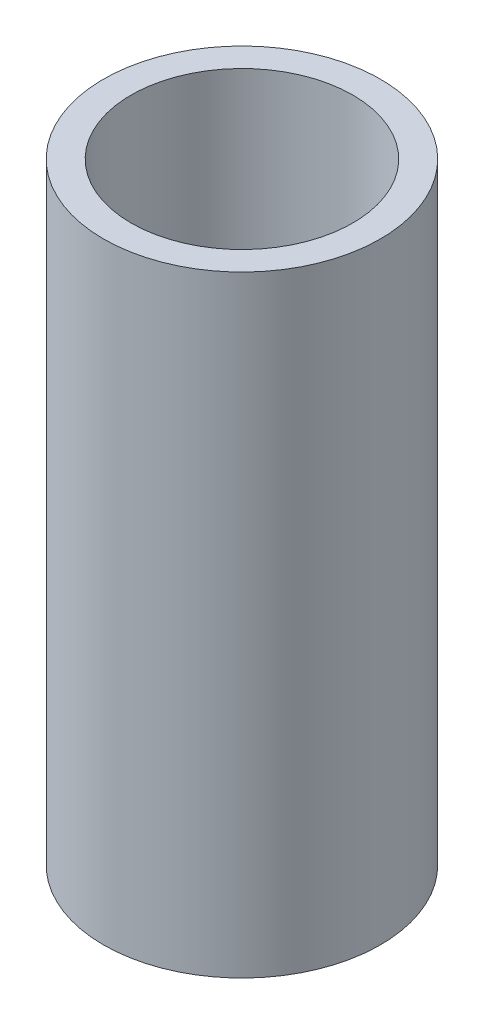
ISO-10303-21;
HEADER;
FILE_DESCRIPTION(('STEP AP214'),'2;1');
FILE_NAME('part.step','',(''),(''),'','','');
FILE_SCHEMA(('AUTOMOTIVE_DESIGN { 1 0 10303 214 1 1 1 1 }'));
ENDSEC;
DATA;
#1=APPLICATION_CONTEXT('core data for automotive mechanical design processes');
#2=APPLICATION_PROTOCOL_DEFINITION('international standard','automotive_design',2000,#1);
#3=PRODUCT_CONTEXT('',#1,'mechanical');
#4=PRODUCT('Part','Part','',(#3));
#5=PRODUCT_RELATED_PRODUCT_CATEGORY('part','',(#4));
#6=PRODUCT_DEFINITION_FORMATION('','',#4);
#7=PRODUCT_DEFINITION_CONTEXT('part definition',#1,'design');
#8=PRODUCT_DEFINITION('design','',#6,#7);
#9=PRODUCT_DEFINITION_SHAPE('','',#8);
#10=(LENGTH_UNIT() NAMED_UNIT(*) SI_UNIT(.MILLI.,.METRE.));
#11=(NAMED_UNIT(*) PLANE_ANGLE_UNIT() SI_UNIT($,.RADIAN.));
#12=(NAMED_UNIT(*) SI_UNIT($,.STERADIAN.) SOLID_ANGLE_UNIT());
#13=UNCERTAINTY_MEASURE_WITH_UNIT(LENGTH_MEASURE(1.E-05),#10,'distance_accuracy_value','');
#14=(GEOMETRIC_REPRESENTATION_CONTEXT(3) GLOBAL_UNCERTAINTY_ASSIGNED_CONTEXT((#13)) GLOBAL_UNIT_ASSIGNED_CONTEXT((#10,
#11,#12)) REPRESENTATION_CONTEXT('',''));
#15=CARTESIAN_POINT('',(0.,0.,0.));
#16=DIRECTION('',(0.,0.,1.));
#17=DIRECTION('',(1.,0.,0.));
#18=AXIS2_PLACEMENT_3D('',#15,#16,#17);
#19=CARTESIAN_POINT('',(0.,9.65,0.));
#20=DIRECTION('',(0.,1.,0.));
#21=DIRECTION('',(0.,0.,1.));
#22=AXIS2_PLACEMENT_3D('',#19,#20,#21);
#23=PLANE('',#22);
#24=CARTESIAN_POINT('',(0.,9.65,0.));
#25=DIRECTION('',(0.,1.,0.));
#26=DIRECTION('',(0.,0.,1.));
#27=AXIS2_PLACEMENT_3D('',#24,#25,#26);
#28=CIRCLE('',#27,2.185);
#29=CARTESIAN_POINT('',(0.,9.65,2.185));
#30=VERTEX_POINT('',#29);
#31=EDGE_CURVE('E10',#30,#30,#28,.T.);
#32=ORIENTED_EDGE('',*,*,#31,.T.);
#33=EDGE_LOOP('',(#32));
#34=FACE_BOUND('',#33,.T.);
#35=CARTESIAN_POINT('',(0.,9.65,0.));
#36=DIRECTION('',(0.,1.,0.));
#37=DIRECTION('',(0.,0.,1.));
#38=AXIS2_PLACEMENT_3D('',#35,#36,#37);
#39=CIRCLE('',#38,1.75);
#40=CARTESIAN_POINT('',(0.,9.65,1.75));
#41=VERTEX_POINT('',#40);
#42=EDGE_CURVE('E50',#41,#41,#39,.T.);
#43=ORIENTED_EDGE('',*,*,#42,.F.);
#44=EDGE_LOOP('',(#43));
#45=FACE_BOUND('',#44,.T.);
#46=ADVANCED_FACE('F37',(#34,#45),#23,.T.);
#47=CARTESIAN_POINT('',(0.,0.,0.));
#48=DIRECTION('',(0.,1.,0.));
#49=DIRECTION('',(0.,0.,1.));
#50=AXIS2_PLACEMENT_3D('',#47,#48,#49);
#51=PLANE('',#50);
#52=CARTESIAN_POINT('',(0.,0.,0.));
#53=DIRECTION('',(0.,1.,0.));
#54=DIRECTION('',(0.,0.,1.));
#55=AXIS2_PLACEMENT_3D('',#52,#53,#54);
#56=CIRCLE('',#55,2.185);
#57=CARTESIAN_POINT('',(0.,0.,2.185));
#58=VERTEX_POINT('',#57);
#59=EDGE_CURVE('E41',#58,#58,#56,.T.);
#60=ORIENTED_EDGE('',*,*,#59,.F.);
#61=EDGE_LOOP('',(#60));
#62=FACE_BOUND('',#61,.T.);
#63=CARTESIAN_POINT('',(0.,0.,0.));
#64=DIRECTION('',(0.,1.,0.));
#65=DIRECTION('',(0.,0.,1.));
#66=AXIS2_PLACEMENT_3D('',#63,#64,#65);
#67=CIRCLE('',#66,1.75);
#68=CARTESIAN_POINT('',(0.,0.,1.75));
#69=VERTEX_POINT('',#68);
#70=EDGE_CURVE('E52',#69,#69,#67,.T.);
#71=ORIENTED_EDGE('',*,*,#70,.T.);
#72=EDGE_LOOP('',(#71));
#73=FACE_BOUND('',#72,.T.);
#74=ADVANCED_FACE('F64',(#62,#73),#51,.F.);
#75=CARTESIAN_POINT('',(0.,9.65,0.));
#76=DIRECTION('',(0.,-1.,0.));
#77=DIRECTION('',(0.,0.,-1.));
#78=AXIS2_PLACEMENT_3D('',#75,#76,#77);
#79=CYLINDRICAL_SURFACE('',#78,2.185);
#80=ORIENTED_EDGE('',*,*,#31,.F.);
#81=EDGE_LOOP('',(#80));
#82=FACE_BOUND('',#81,.T.);
#83=ORIENTED_EDGE('',*,*,#59,.T.);
#84=EDGE_LOOP('',(#83));
#85=FACE_BOUND('',#84,.T.);
#86=ADVANCED_FACE('F39',(#82,#85),#79,.T.);
#87=CARTESIAN_POINT('',(0.,9.65,0.));
#88=DIRECTION('',(0.,-1.,0.));
#89=DIRECTION('',(0.,0.,-1.));
#90=AXIS2_PLACEMENT_3D('',#87,#88,#89);
#91=CYLINDRICAL_SURFACE('',#90,1.75);
#92=ORIENTED_EDGE('',*,*,#42,.T.);
#93=EDGE_LOOP('',(#92));
#94=FACE_BOUND('',#93,.T.);
#95=ORIENTED_EDGE('',*,*,#70,.F.);
#96=EDGE_LOOP('',(#95));
#97=FACE_BOUND('',#96,.T.);
#98=ADVANCED_FACE('F60',(#94,#97),#91,.F.);
#99=CLOSED_SHELL('',(#46,#74,#86,#98));
#100=MANIFOLD_SOLID_BREP('B2',#99);
#101=ADVANCED_BREP_SHAPE_REPRESENTATION('',(#18,#100),#14);
#102=SHAPE_DEFINITION_REPRESENTATION(#9,#101);
ENDSEC;
END-ISO-10303-21;
